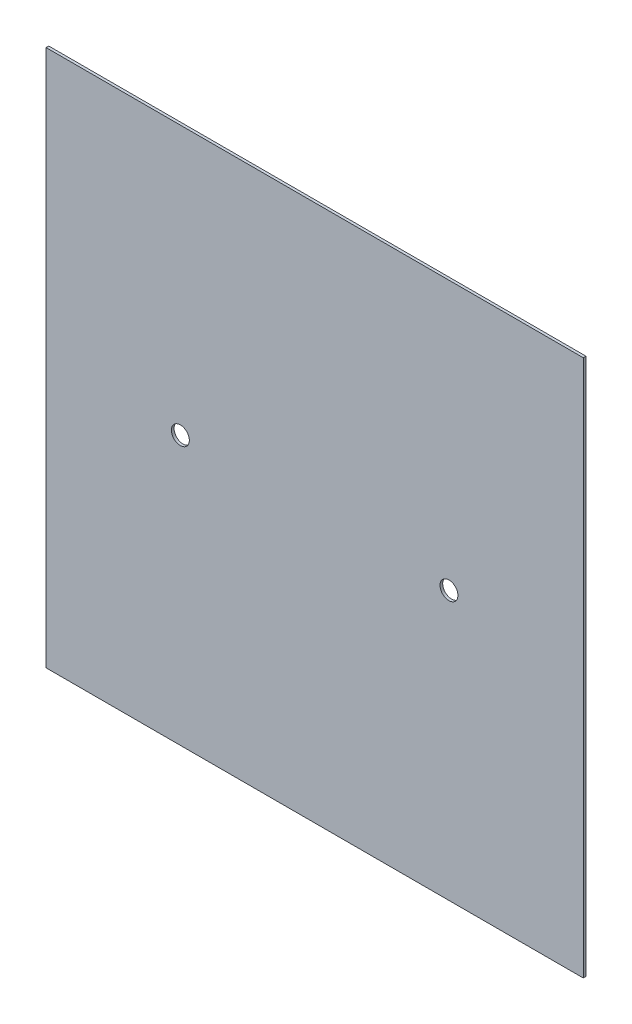
ISO-10303-21;
HEADER;
FILE_DESCRIPTION(('STEP AP214'),'2;1');
FILE_NAME('part.step','',(''),(''),'','','');
FILE_SCHEMA(('AUTOMOTIVE_DESIGN { 1 0 10303 214 1 1 1 1 }'));
ENDSEC;
DATA;
#1=APPLICATION_CONTEXT('core data for automotive mechanical design processes');
#2=APPLICATION_PROTOCOL_DEFINITION('international standard','automotive_design',2000,#1);
#3=PRODUCT_CONTEXT('',#1,'mechanical');
#4=PRODUCT('Part','Part','',(#3));
#5=PRODUCT_RELATED_PRODUCT_CATEGORY('part','',(#4));
#6=PRODUCT_DEFINITION_FORMATION('','',#4);
#7=PRODUCT_DEFINITION_CONTEXT('part definition',#1,'design');
#8=PRODUCT_DEFINITION('design','',#6,#7);
#9=PRODUCT_DEFINITION_SHAPE('','',#8);
#10=(LENGTH_UNIT() NAMED_UNIT(*) SI_UNIT(.MILLI.,.METRE.));
#11=(NAMED_UNIT(*) PLANE_ANGLE_UNIT() SI_UNIT($,.RADIAN.));
#12=(NAMED_UNIT(*) SI_UNIT($,.STERADIAN.) SOLID_ANGLE_UNIT());
#13=UNCERTAINTY_MEASURE_WITH_UNIT(LENGTH_MEASURE(1.E-05),#10,'distance_accuracy_value','');
#14=(GEOMETRIC_REPRESENTATION_CONTEXT(3) GLOBAL_UNCERTAINTY_ASSIGNED_CONTEXT((#13)) GLOBAL_UNIT_ASSIGNED_CONTEXT((#10,
#11,#12)) REPRESENTATION_CONTEXT('',''));
#15=CARTESIAN_POINT('',(0.,0.,0.));
#16=DIRECTION('',(0.,0.,1.));
#17=DIRECTION('',(1.,0.,0.));
#18=AXIS2_PLACEMENT_3D('',#15,#16,#17);
#19=CARTESIAN_POINT('',(0.,0.,1.5));
#20=DIRECTION('',(0.,0.,1.));
#21=DIRECTION('',(1.,0.,0.));
#22=AXIS2_PLACEMENT_3D('',#19,#20,#21);
#23=PLANE('',#22);
#24=CARTESIAN_POINT('',(-75.,0.,1.5));
#25=DIRECTION('',(0.,0.,1.));
#26=DIRECTION('',(1.,0.,0.));
#27=AXIS2_PLACEMENT_3D('',#24,#25,#26);
#28=CIRCLE('',#27,5.);
#29=CARTESIAN_POINT('',(-70.,0.,1.5));
#30=VERTEX_POINT('',#29);
#31=EDGE_CURVE('E116',#30,#30,#28,.T.);
#32=ORIENTED_EDGE('',*,*,#31,.F.);
#33=EDGE_LOOP('',(#32));
#34=FACE_BOUND('',#33,.T.);
#35=DIRECTION('',(0.,1.,0.));
#36=VECTOR('',#35,1.);
#37=CARTESIAN_POINT('',(150.,150.,1.5));
#38=LINE('',#37,#36);
#39=CARTESIAN_POINT('',(150.,-150.,1.5));
#40=VERTEX_POINT('',#39);
#41=CARTESIAN_POINT('',(150.,150.,1.5));
#42=VERTEX_POINT('',#41);
#43=EDGE_CURVE('E96',#40,#42,#38,.T.);
#44=ORIENTED_EDGE('',*,*,#43,.T.);
#45=DIRECTION('',(-1.,0.,0.));
#46=VECTOR('',#45,1.);
#47=CARTESIAN_POINT('',(-150.,150.,1.5));
#48=LINE('',#47,#46);
#49=CARTESIAN_POINT('',(-150.,150.,1.5));
#50=VERTEX_POINT('',#49);
#51=EDGE_CURVE('E91',#42,#50,#48,.T.);
#52=ORIENTED_EDGE('',*,*,#51,.T.);
#53=DIRECTION('',(0.,-1.,0.));
#54=VECTOR('',#53,1.);
#55=CARTESIAN_POINT('',(-150.,150.,1.5));
#56=LINE('',#55,#54);
#57=CARTESIAN_POINT('',(-150.,-150.,1.5));
#58=VERTEX_POINT('',#57);
#59=EDGE_CURVE('E94',#50,#58,#56,.T.);
#60=ORIENTED_EDGE('',*,*,#59,.T.);
#61=DIRECTION('',(1.,0.,0.));
#62=VECTOR('',#61,1.);
#63=CARTESIAN_POINT('',(-150.,-150.,1.5));
#64=LINE('',#63,#62);
#65=EDGE_CURVE('E61',#58,#40,#64,.T.);
#66=ORIENTED_EDGE('',*,*,#65,.T.);
#67=EDGE_LOOP('',(#44,#52,#60,#66));
#68=FACE_BOUND('',#67,.T.);
#69=CARTESIAN_POINT('',(75.,0.,1.5));
#70=DIRECTION('',(0.,0.,1.));
#71=DIRECTION('',(1.,0.,0.));
#72=AXIS2_PLACEMENT_3D('',#69,#70,#71);
#73=CIRCLE('',#72,5.);
#74=CARTESIAN_POINT('',(80.,0.,1.5));
#75=VERTEX_POINT('',#74);
#76=EDGE_CURVE('E138',#75,#75,#73,.T.);
#77=ORIENTED_EDGE('',*,*,#76,.F.);
#78=EDGE_LOOP('',(#77));
#79=FACE_BOUND('',#78,.T.);
#80=ADVANCED_FACE('F43',(#34,#68,#79),#23,.T.);
#81=CARTESIAN_POINT('',(0.,0.,0.));
#82=DIRECTION('',(0.,0.,1.));
#83=DIRECTION('',(1.,0.,0.));
#84=AXIS2_PLACEMENT_3D('',#81,#82,#83);
#85=PLANE('',#84);
#86=DIRECTION('',(0.,1.,0.));
#87=VECTOR('',#86,1.);
#88=CARTESIAN_POINT('',(150.,150.,0.));
#89=LINE('',#88,#87);
#90=CARTESIAN_POINT('',(150.,-150.,0.));
#91=VERTEX_POINT('',#90);
#92=CARTESIAN_POINT('',(150.,150.,0.));
#93=VERTEX_POINT('',#92);
#94=EDGE_CURVE('E112',#91,#93,#89,.T.);
#95=ORIENTED_EDGE('',*,*,#94,.F.);
#96=DIRECTION('',(1.,0.,0.));
#97=VECTOR('',#96,1.);
#98=CARTESIAN_POINT('',(-150.,-150.,0.));
#99=LINE('',#98,#97);
#100=CARTESIAN_POINT('',(-150.,-150.,0.));
#101=VERTEX_POINT('',#100);
#102=EDGE_CURVE('E84',#101,#91,#99,.T.);
#103=ORIENTED_EDGE('',*,*,#102,.F.);
#104=DIRECTION('',(0.,-1.,0.));
#105=VECTOR('',#104,1.);
#106=CARTESIAN_POINT('',(-150.,150.,0.));
#107=LINE('',#106,#105);
#108=CARTESIAN_POINT('',(-150.,150.,0.));
#109=VERTEX_POINT('',#108);
#110=EDGE_CURVE('E78',#109,#101,#107,.T.);
#111=ORIENTED_EDGE('',*,*,#110,.F.);
#112=DIRECTION('',(-1.,0.,0.));
#113=VECTOR('',#112,1.);
#114=CARTESIAN_POINT('',(-150.,150.,0.));
#115=LINE('',#114,#113);
#116=EDGE_CURVE('E101',#93,#109,#115,.T.);
#117=ORIENTED_EDGE('',*,*,#116,.F.);
#118=EDGE_LOOP('',(#95,#103,#111,#117));
#119=FACE_BOUND('',#118,.T.);
#120=CARTESIAN_POINT('',(-75.,0.,0.));
#121=DIRECTION('',(0.,0.,1.));
#122=DIRECTION('',(1.,0.,0.));
#123=AXIS2_PLACEMENT_3D('',#120,#121,#122);
#124=CIRCLE('',#123,5.);
#125=CARTESIAN_POINT('',(-70.,0.,0.));
#126=VERTEX_POINT('',#125);
#127=EDGE_CURVE('E134',#126,#126,#124,.T.);
#128=ORIENTED_EDGE('',*,*,#127,.T.);
#129=EDGE_LOOP('',(#128));
#130=FACE_BOUND('',#129,.T.);
#131=CARTESIAN_POINT('',(75.,0.,0.));
#132=DIRECTION('',(0.,0.,1.));
#133=DIRECTION('',(1.,0.,0.));
#134=AXIS2_PLACEMENT_3D('',#131,#132,#133);
#135=CIRCLE('',#134,5.);
#136=CARTESIAN_POINT('',(80.,0.,0.));
#137=VERTEX_POINT('',#136);
#138=EDGE_CURVE('E142',#137,#137,#135,.T.);
#139=ORIENTED_EDGE('',*,*,#138,.T.);
#140=EDGE_LOOP('',(#139));
#141=FACE_BOUND('',#140,.T.);
#142=ADVANCED_FACE('F129',(#119,#130,#141),#85,.F.);
#143=CARTESIAN_POINT('',(150.,150.,1.5));
#144=DIRECTION('',(-1.,0.,0.));
#145=DIRECTION('',(0.,-1.,0.));
#146=AXIS2_PLACEMENT_3D('',#143,#144,#145);
#147=PLANE('',#146);
#148=ORIENTED_EDGE('',*,*,#94,.T.);
#149=DIRECTION('',(0.,0.,-1.));
#150=VECTOR('',#149,1.);
#151=CARTESIAN_POINT('',(150.,150.,1.5));
#152=LINE('',#151,#150);
#153=EDGE_CURVE('E11',#42,#93,#152,.T.);
#154=ORIENTED_EDGE('',*,*,#153,.F.);
#155=ORIENTED_EDGE('',*,*,#43,.F.);
#156=DIRECTION('',(0.,0.,-1.));
#157=VECTOR('',#156,1.);
#158=CARTESIAN_POINT('',(150.,-150.,1.5));
#159=LINE('',#158,#157);
#160=EDGE_CURVE('E108',#40,#91,#159,.T.);
#161=ORIENTED_EDGE('',*,*,#160,.T.);
#162=EDGE_LOOP('',(#148,#154,#155,#161));
#163=FACE_BOUND('',#162,.T.);
#164=ADVANCED_FACE('F45',(#163),#147,.F.);
#165=CARTESIAN_POINT('',(-150.,150.,1.5));
#166=DIRECTION('',(0.,-1.,0.));
#167=DIRECTION('',(0.,0.,-1.));
#168=AXIS2_PLACEMENT_3D('',#165,#166,#167);
#169=PLANE('',#168);
#170=ORIENTED_EDGE('',*,*,#116,.T.);
#171=DIRECTION('',(0.,0.,-1.));
#172=VECTOR('',#171,1.);
#173=CARTESIAN_POINT('',(-150.,150.,1.5));
#174=LINE('',#173,#172);
#175=EDGE_CURVE('E53',#50,#109,#174,.T.);
#176=ORIENTED_EDGE('',*,*,#175,.F.);
#177=ORIENTED_EDGE('',*,*,#51,.F.);
#178=ORIENTED_EDGE('',*,*,#153,.T.);
#179=EDGE_LOOP('',(#170,#176,#177,#178));
#180=FACE_BOUND('',#179,.T.);
#181=ADVANCED_FACE('F100',(#180),#169,.F.);
#182=CARTESIAN_POINT('',(-150.,150.,1.5));
#183=DIRECTION('',(1.,0.,0.));
#184=DIRECTION('',(0.,1.,0.));
#185=AXIS2_PLACEMENT_3D('',#182,#183,#184);
#186=PLANE('',#185);
#187=ORIENTED_EDGE('',*,*,#110,.T.);
#188=DIRECTION('',(0.,0.,-1.));
#189=VECTOR('',#188,1.);
#190=CARTESIAN_POINT('',(-150.,-150.,1.5));
#191=LINE('',#190,#189);
#192=EDGE_CURVE('E103',#58,#101,#191,.T.);
#193=ORIENTED_EDGE('',*,*,#192,.F.);
#194=ORIENTED_EDGE('',*,*,#59,.F.);
#195=ORIENTED_EDGE('',*,*,#175,.T.);
#196=EDGE_LOOP('',(#187,#193,#194,#195));
#197=FACE_BOUND('',#196,.T.);
#198=ADVANCED_FACE('F104',(#197),#186,.F.);
#199=CARTESIAN_POINT('',(-150.,-150.,1.5));
#200=DIRECTION('',(0.,1.,0.));
#201=DIRECTION('',(0.,0.,1.));
#202=AXIS2_PLACEMENT_3D('',#199,#200,#201);
#203=PLANE('',#202);
#204=ORIENTED_EDGE('',*,*,#102,.T.);
#205=ORIENTED_EDGE('',*,*,#160,.F.);
#206=ORIENTED_EDGE('',*,*,#65,.F.);
#207=ORIENTED_EDGE('',*,*,#192,.T.);
#208=EDGE_LOOP('',(#204,#205,#206,#207));
#209=FACE_BOUND('',#208,.T.);
#210=ADVANCED_FACE('F126',(#209),#203,.F.);
#211=CARTESIAN_POINT('',(-75.,0.,1.5));
#212=DIRECTION('',(0.,0.,-1.));
#213=DIRECTION('',(-1.,0.,0.));
#214=AXIS2_PLACEMENT_3D('',#211,#212,#213);
#215=CYLINDRICAL_SURFACE('',#214,5.);
#216=ORIENTED_EDGE('',*,*,#31,.T.);
#217=EDGE_LOOP('',(#216));
#218=FACE_BOUND('',#217,.T.);
#219=ORIENTED_EDGE('',*,*,#127,.F.);
#220=EDGE_LOOP('',(#219));
#221=FACE_BOUND('',#220,.T.);
#222=ADVANCED_FACE('F161',(#218,#221),#215,.F.);
#223=CARTESIAN_POINT('',(75.,0.,1.5));
#224=DIRECTION('',(0.,0.,-1.));
#225=DIRECTION('',(-1.,0.,0.));
#226=AXIS2_PLACEMENT_3D('',#223,#224,#225);
#227=CYLINDRICAL_SURFACE('',#226,5.);
#228=ORIENTED_EDGE('',*,*,#76,.T.);
#229=EDGE_LOOP('',(#228));
#230=FACE_BOUND('',#229,.T.);
#231=ORIENTED_EDGE('',*,*,#138,.F.);
#232=EDGE_LOOP('',(#231));
#233=FACE_BOUND('',#232,.T.);
#234=ADVANCED_FACE('F150',(#230,#233),#227,.F.);
#235=CLOSED_SHELL('',(#80,#142,#164,#181,#198,#210,#222,#234));
#236=MANIFOLD_SOLID_BREP('B2',#235);
#237=ADVANCED_BREP_SHAPE_REPRESENTATION('',(#18,#236),#14);
#238=SHAPE_DEFINITION_REPRESENTATION(#9,#237);
ENDSEC;
END-ISO-10303-21;
